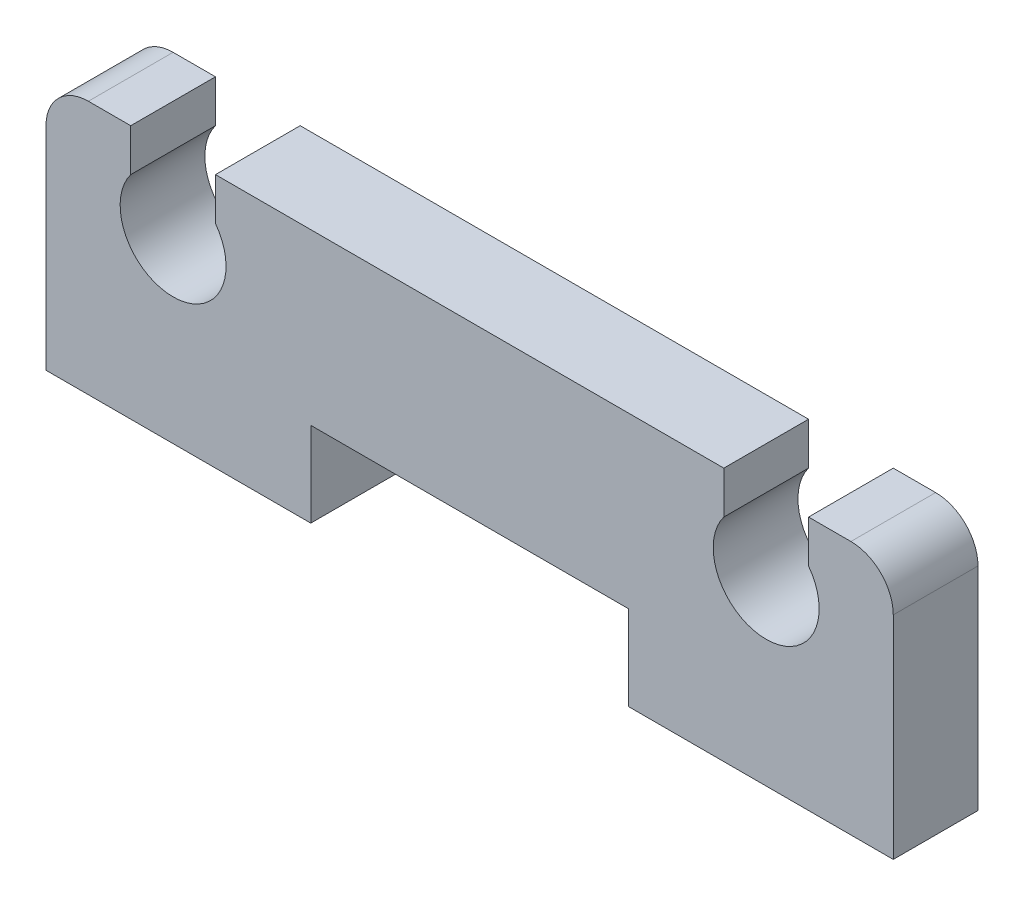
ISO-10303-21;
HEADER;
FILE_DESCRIPTION(('STEP AP214'),'2;1');
FILE_NAME('part.step','',(''),(''),'','','');
FILE_SCHEMA(('AUTOMOTIVE_DESIGN { 1 0 10303 214 1 1 1 1 }'));
ENDSEC;
DATA;
#1=APPLICATION_CONTEXT('core data for automotive mechanical design processes');
#2=APPLICATION_PROTOCOL_DEFINITION('international standard','automotive_design',2000,#1);
#3=PRODUCT_CONTEXT('',#1,'mechanical');
#4=PRODUCT('Part','Part','',(#3));
#5=PRODUCT_RELATED_PRODUCT_CATEGORY('part','',(#4));
#6=PRODUCT_DEFINITION_FORMATION('','',#4);
#7=PRODUCT_DEFINITION_CONTEXT('part definition',#1,'design');
#8=PRODUCT_DEFINITION('design','',#6,#7);
#9=PRODUCT_DEFINITION_SHAPE('','',#8);
#10=(LENGTH_UNIT() NAMED_UNIT(*) SI_UNIT(.MILLI.,.METRE.));
#11=(NAMED_UNIT(*) PLANE_ANGLE_UNIT() SI_UNIT($,.RADIAN.));
#12=(NAMED_UNIT(*) SI_UNIT($,.STERADIAN.) SOLID_ANGLE_UNIT());
#13=UNCERTAINTY_MEASURE_WITH_UNIT(LENGTH_MEASURE(1.E-05),#10,'distance_accuracy_value','');
#14=(GEOMETRIC_REPRESENTATION_CONTEXT(3) GLOBAL_UNCERTAINTY_ASSIGNED_CONTEXT((#13)) GLOBAL_UNIT_ASSIGNED_CONTEXT((#10,
#11,#12)) REPRESENTATION_CONTEXT('',''));
#15=CARTESIAN_POINT('',(0.,0.,0.));
#16=DIRECTION('',(0.,0.,1.));
#17=DIRECTION('',(1.,0.,0.));
#18=AXIS2_PLACEMENT_3D('',#15,#16,#17);
#19=CARTESIAN_POINT('',(1966.10984128656,1293.96021685123,2.));
#20=DIRECTION('',(0.,0.,-1.));
#21=DIRECTION('',(-1.,0.,0.));
#22=AXIS2_PLACEMENT_3D('',#19,#20,#21);
#23=CYLINDRICAL_SURFACE('',#22,1.);
#24=CARTESIAN_POINT('',(1966.10984128656,1293.96021685123,0.));
#25=DIRECTION('',(0.,0.,1.));
#26=DIRECTION('',(1.,0.,0.));
#27=AXIS2_PLACEMENT_3D('',#24,#25,#26);
#28=CIRCLE('',#27,1.);
#29=CARTESIAN_POINT('',(1966.10984128656,1294.96021685123,0.));
#30=VERTEX_POINT('',#29);
#31=CARTESIAN_POINT('',(1965.10984128656,1293.96021685123,0.));
#32=VERTEX_POINT('',#31);
#33=EDGE_CURVE('E190',#30,#32,#28,.T.);
#34=ORIENTED_EDGE('',*,*,#33,.T.);
#35=DIRECTION('',(0.,0.,-1.));
#36=VECTOR('',#35,1.);
#37=CARTESIAN_POINT('',(1965.10984128656,1293.96021685123,2.));
#38=LINE('',#37,#36);
#39=CARTESIAN_POINT('',(1965.10984128656,1293.96021685123,2.));
#40=VERTEX_POINT('',#39);
#41=EDGE_CURVE('E11',#40,#32,#38,.T.);
#42=ORIENTED_EDGE('',*,*,#41,.F.);
#43=CARTESIAN_POINT('',(1966.10984128656,1293.96021685123,2.));
#44=DIRECTION('',(0.,0.,1.));
#45=DIRECTION('',(1.,0.,0.));
#46=AXIS2_PLACEMENT_3D('',#43,#44,#45);
#47=CIRCLE('',#46,1.);
#48=CARTESIAN_POINT('',(1966.10984128656,1294.96021685123,2.));
#49=VERTEX_POINT('',#48);
#50=EDGE_CURVE('E224',#49,#40,#47,.T.);
#51=ORIENTED_EDGE('',*,*,#50,.F.);
#52=DIRECTION('',(0.,0.,-1.));
#53=VECTOR('',#52,1.);
#54=CARTESIAN_POINT('',(1966.10984128656,1294.96021685123,2.));
#55=LINE('',#54,#53);
#56=EDGE_CURVE('E186',#49,#30,#55,.T.);
#57=ORIENTED_EDGE('',*,*,#56,.T.);
#58=EDGE_LOOP('',(#34,#42,#51,#57));
#59=FACE_BOUND('',#58,.T.);
#60=ADVANCED_FACE('F34',(#59),#23,.T.);
#61=CARTESIAN_POINT('',(1965.10984128656,1288.96021685123,2.));
#62=DIRECTION('',(1.,0.,0.));
#63=DIRECTION('',(0.,0.,-1.));
#64=AXIS2_PLACEMENT_3D('',#61,#62,#63);
#65=PLANE('',#64);
#66=DIRECTION('',(0.,-1.,0.));
#67=VECTOR('',#66,1.);
#68=CARTESIAN_POINT('',(1965.10984128656,1288.96021685123,0.));
#69=LINE('',#68,#67);
#70=CARTESIAN_POINT('',(1965.10984128656,1288.96021685123,0.));
#71=VERTEX_POINT('',#70);
#72=EDGE_CURVE('E193',#32,#71,#69,.T.);
#73=ORIENTED_EDGE('',*,*,#72,.T.);
#74=DIRECTION('',(0.,0.,-1.));
#75=VECTOR('',#74,1.);
#76=CARTESIAN_POINT('',(1965.10984128656,1288.96021685123,2.));
#77=LINE('',#76,#75);
#78=CARTESIAN_POINT('',(1965.10984128656,1288.96021685123,2.));
#79=VERTEX_POINT('',#78);
#80=EDGE_CURVE('E42',#79,#71,#77,.T.);
#81=ORIENTED_EDGE('',*,*,#80,.F.);
#82=DIRECTION('',(0.,-1.,0.));
#83=VECTOR('',#82,1.);
#84=CARTESIAN_POINT('',(1965.10984128656,1288.96021685123,2.));
#85=LINE('',#84,#83);
#86=EDGE_CURVE('E123',#40,#79,#85,.T.);
#87=ORIENTED_EDGE('',*,*,#86,.F.);
#88=ORIENTED_EDGE('',*,*,#41,.T.);
#89=EDGE_LOOP('',(#73,#81,#87,#88));
#90=FACE_BOUND('',#89,.T.);
#91=ADVANCED_FACE('F332',(#90),#65,.F.);
#92=CARTESIAN_POINT('',(1965.10984128656,1288.96021685123,2.));
#93=DIRECTION('',(0.,1.,0.));
#94=DIRECTION('',(0.,0.,1.));
#95=AXIS2_PLACEMENT_3D('',#92,#93,#94);
#96=PLANE('',#95);
#97=DIRECTION('',(1.,0.,0.));
#98=VECTOR('',#97,1.);
#99=CARTESIAN_POINT('',(1965.10984128656,1288.96021685123,0.));
#100=LINE('',#99,#98);
#101=CARTESIAN_POINT('',(1971.35984128656,1288.96021685123,0.));
#102=VERTEX_POINT('',#101);
#103=EDGE_CURVE('E195',#71,#102,#100,.T.);
#104=ORIENTED_EDGE('',*,*,#103,.T.);
#105=DIRECTION('',(0.,0.,-1.));
#106=VECTOR('',#105,1.);
#107=CARTESIAN_POINT('',(1971.35984128656,1288.96021685123,2.));
#108=LINE('',#107,#106);
#109=CARTESIAN_POINT('',(1971.35984128656,1288.96021685123,2.));
#110=VERTEX_POINT('',#109);
#111=EDGE_CURVE('E261',#110,#102,#108,.T.);
#112=ORIENTED_EDGE('',*,*,#111,.F.);
#113=DIRECTION('',(1.,0.,0.));
#114=VECTOR('',#113,1.);
#115=CARTESIAN_POINT('',(1965.10984128656,1288.96021685123,2.));
#116=LINE('',#115,#114);
#117=EDGE_CURVE('E269',#79,#110,#116,.T.);
#118=ORIENTED_EDGE('',*,*,#117,.F.);
#119=ORIENTED_EDGE('',*,*,#80,.T.);
#120=EDGE_LOOP('',(#104,#112,#118,#119));
#121=FACE_BOUND('',#120,.T.);
#122=ADVANCED_FACE('F267',(#121),#96,.F.);
#123=CARTESIAN_POINT('',(1971.35984128656,1290.96021685123,2.));
#124=DIRECTION('',(-1.,-1.11022302462503E-13,0.));
#125=DIRECTION('',(1.11022302462503E-13,-1.,0.));
#126=AXIS2_PLACEMENT_3D('',#123,#124,#125);
#127=PLANE('',#126);
#128=DIRECTION('',(-1.11022302462503E-13,1.,0.));
#129=VECTOR('',#128,1.);
#130=CARTESIAN_POINT('',(1971.35984128656,1290.96021685123,0.));
#131=LINE('',#130,#129);
#132=CARTESIAN_POINT('',(1971.35984128656,1290.96021685123,0.));
#133=VERTEX_POINT('',#132);
#134=EDGE_CURVE('E197',#102,#133,#131,.T.);
#135=ORIENTED_EDGE('',*,*,#134,.T.);
#136=DIRECTION('',(0.,0.,-1.));
#137=VECTOR('',#136,1.);
#138=CARTESIAN_POINT('',(1971.35984128656,1290.96021685123,2.));
#139=LINE('',#138,#137);
#140=CARTESIAN_POINT('',(1971.35984128656,1290.96021685123,2.));
#141=VERTEX_POINT('',#140);
#142=EDGE_CURVE('E258',#141,#133,#139,.T.);
#143=ORIENTED_EDGE('',*,*,#142,.F.);
#144=DIRECTION('',(-1.11022302462503E-13,1.,0.));
#145=VECTOR('',#144,1.);
#146=CARTESIAN_POINT('',(1971.35984128656,1290.96021685123,2.));
#147=LINE('',#146,#145);
#148=EDGE_CURVE('E287',#110,#141,#147,.T.);
#149=ORIENTED_EDGE('',*,*,#148,.F.);
#150=ORIENTED_EDGE('',*,*,#111,.T.);
#151=EDGE_LOOP('',(#135,#143,#149,#150));
#152=FACE_BOUND('',#151,.T.);
#153=ADVANCED_FACE('F278',(#152),#127,.F.);
#154=CARTESIAN_POINT('',(1971.35984128656,1290.96021685123,2.));
#155=DIRECTION('',(0.,1.,0.));
#156=DIRECTION('',(0.,0.,1.));
#157=AXIS2_PLACEMENT_3D('',#154,#155,#156);
#158=PLANE('',#157);
#159=DIRECTION('',(1.,0.,0.));
#160=VECTOR('',#159,1.);
#161=CARTESIAN_POINT('',(1971.35984128656,1290.96021685123,0.));
#162=LINE('',#161,#160);
#163=CARTESIAN_POINT('',(1978.85984128656,1290.96021685123,0.));
#164=VERTEX_POINT('',#163);
#165=EDGE_CURVE('E199',#133,#164,#162,.T.);
#166=ORIENTED_EDGE('',*,*,#165,.T.);
#167=DIRECTION('',(0.,0.,-1.));
#168=VECTOR('',#167,1.);
#169=CARTESIAN_POINT('',(1978.85984128656,1290.96021685123,2.));
#170=LINE('',#169,#168);
#171=CARTESIAN_POINT('',(1978.85984128656,1290.96021685123,2.));
#172=VERTEX_POINT('',#171);
#173=EDGE_CURVE('E255',#172,#164,#170,.T.);
#174=ORIENTED_EDGE('',*,*,#173,.F.);
#175=DIRECTION('',(1.,0.,0.));
#176=VECTOR('',#175,1.);
#177=CARTESIAN_POINT('',(1971.35984128656,1290.96021685123,2.));
#178=LINE('',#177,#176);
#179=EDGE_CURVE('E284',#141,#172,#178,.T.);
#180=ORIENTED_EDGE('',*,*,#179,.F.);
#181=ORIENTED_EDGE('',*,*,#142,.T.);
#182=EDGE_LOOP('',(#166,#174,#180,#181));
#183=FACE_BOUND('',#182,.T.);
#184=ADVANCED_FACE('F282',(#183),#158,.F.);
#185=CARTESIAN_POINT('',(1978.85984128656,1290.96021685123,2.));
#186=DIRECTION('',(1.,1.11022302462503E-13,0.));
#187=DIRECTION('',(-1.11022302462503E-13,1.,0.));
#188=AXIS2_PLACEMENT_3D('',#185,#186,#187);
#189=PLANE('',#188);
#190=DIRECTION('',(1.11022302462503E-13,-1.,0.));
#191=VECTOR('',#190,1.);
#192=CARTESIAN_POINT('',(1978.85984128656,1290.96021685123,0.));
#193=LINE('',#192,#191);
#194=CARTESIAN_POINT('',(1978.85984128656,1288.96021685123,0.));
#195=VERTEX_POINT('',#194);
#196=EDGE_CURVE('E201',#164,#195,#193,.T.);
#197=ORIENTED_EDGE('',*,*,#196,.T.);
#198=DIRECTION('',(0.,0.,-1.));
#199=VECTOR('',#198,1.);
#200=CARTESIAN_POINT('',(1978.85984128656,1288.96021685123,2.));
#201=LINE('',#200,#199);
#202=CARTESIAN_POINT('',(1978.85984128656,1288.96021685123,2.));
#203=VERTEX_POINT('',#202);
#204=EDGE_CURVE('E252',#203,#195,#201,.T.);
#205=ORIENTED_EDGE('',*,*,#204,.F.);
#206=DIRECTION('',(1.11022302462503E-13,-1.,0.));
#207=VECTOR('',#206,1.);
#208=CARTESIAN_POINT('',(1978.85984128656,1290.96021685123,2.));
#209=LINE('',#208,#207);
#210=EDGE_CURVE('E286',#172,#203,#209,.T.);
#211=ORIENTED_EDGE('',*,*,#210,.F.);
#212=ORIENTED_EDGE('',*,*,#173,.T.);
#213=EDGE_LOOP('',(#197,#205,#211,#212));
#214=FACE_BOUND('',#213,.T.);
#215=ADVANCED_FACE('F345',(#214),#189,.F.);
#216=CARTESIAN_POINT('',(1978.85984128656,1288.96021685123,2.));
#217=DIRECTION('',(0.,1.,0.));
#218=DIRECTION('',(0.,0.,1.));
#219=AXIS2_PLACEMENT_3D('',#216,#217,#218);
#220=PLANE('',#219);
#221=DIRECTION('',(1.,0.,0.));
#222=VECTOR('',#221,1.);
#223=CARTESIAN_POINT('',(1978.85984128656,1288.96021685123,0.));
#224=LINE('',#223,#222);
#225=CARTESIAN_POINT('',(1985.10984128656,1288.96021685123,0.));
#226=VERTEX_POINT('',#225);
#227=EDGE_CURVE('E203',#195,#226,#224,.T.);
#228=ORIENTED_EDGE('',*,*,#227,.T.);
#229=DIRECTION('',(0.,0.,-1.));
#230=VECTOR('',#229,1.);
#231=CARTESIAN_POINT('',(1985.10984128656,1288.96021685123,2.));
#232=LINE('',#231,#230);
#233=CARTESIAN_POINT('',(1985.10984128656,1288.96021685123,2.));
#234=VERTEX_POINT('',#233);
#235=EDGE_CURVE('E249',#234,#226,#232,.T.);
#236=ORIENTED_EDGE('',*,*,#235,.F.);
#237=DIRECTION('',(1.,0.,0.));
#238=VECTOR('',#237,1.);
#239=CARTESIAN_POINT('',(1978.85984128656,1288.96021685123,2.));
#240=LINE('',#239,#238);
#241=EDGE_CURVE('E289',#203,#234,#240,.T.);
#242=ORIENTED_EDGE('',*,*,#241,.F.);
#243=ORIENTED_EDGE('',*,*,#204,.T.);
#244=EDGE_LOOP('',(#228,#236,#242,#243));
#245=FACE_BOUND('',#244,.T.);
#246=ADVANCED_FACE('F348',(#245),#220,.F.);
#247=CARTESIAN_POINT('',(1985.10984128656,1293.96021685123,2.));
#248=DIRECTION('',(-1.,0.,0.));
#249=DIRECTION('',(0.,0.,1.));
#250=AXIS2_PLACEMENT_3D('',#247,#248,#249);
#251=PLANE('',#250);
#252=DIRECTION('',(0.,1.,0.));
#253=VECTOR('',#252,1.);
#254=CARTESIAN_POINT('',(1985.10984128656,1293.96021685123,0.));
#255=LINE('',#254,#253);
#256=CARTESIAN_POINT('',(1985.10984128656,1293.96021685123,0.));
#257=VERTEX_POINT('',#256);
#258=EDGE_CURVE('E205',#226,#257,#255,.T.);
#259=ORIENTED_EDGE('',*,*,#258,.T.);
#260=DIRECTION('',(0.,0.,-1.));
#261=VECTOR('',#260,1.);
#262=CARTESIAN_POINT('',(1985.10984128656,1293.96021685123,2.));
#263=LINE('',#262,#261);
#264=CARTESIAN_POINT('',(1985.10984128656,1293.96021685123,2.));
#265=VERTEX_POINT('',#264);
#266=EDGE_CURVE('E246',#265,#257,#263,.T.);
#267=ORIENTED_EDGE('',*,*,#266,.F.);
#268=DIRECTION('',(0.,1.,0.));
#269=VECTOR('',#268,1.);
#270=CARTESIAN_POINT('',(1985.10984128656,1293.96021685123,2.));
#271=LINE('',#270,#269);
#272=EDGE_CURVE('E295',#234,#265,#271,.T.);
#273=ORIENTED_EDGE('',*,*,#272,.F.);
#274=ORIENTED_EDGE('',*,*,#235,.T.);
#275=EDGE_LOOP('',(#259,#267,#273,#274));
#276=FACE_BOUND('',#275,.T.);
#277=ADVANCED_FACE('F352',(#276),#251,.F.);
#278=CARTESIAN_POINT('',(1984.10984128656,1293.96021685123,2.));
#279=DIRECTION('',(0.,0.,-1.));
#280=DIRECTION('',(-1.,0.,0.));
#281=AXIS2_PLACEMENT_3D('',#278,#279,#280);
#282=CYLINDRICAL_SURFACE('',#281,1.00000000000011);
#283=CARTESIAN_POINT('',(1984.10984128656,1293.96021685123,0.));
#284=DIRECTION('',(0.,0.,1.));
#285=DIRECTION('',(1.,0.,0.));
#286=AXIS2_PLACEMENT_3D('',#283,#284,#285);
#287=CIRCLE('',#286,1.00000000000011);
#288=CARTESIAN_POINT('',(1984.10984128656,1294.96021685123,0.));
#289=VERTEX_POINT('',#288);
#290=EDGE_CURVE('E207',#257,#289,#287,.T.);
#291=ORIENTED_EDGE('',*,*,#290,.T.);
#292=DIRECTION('',(0.,0.,-1.));
#293=VECTOR('',#292,1.);
#294=CARTESIAN_POINT('',(1984.10984128656,1294.96021685123,2.));
#295=LINE('',#294,#293);
#296=CARTESIAN_POINT('',(1984.10984128656,1294.96021685123,2.));
#297=VERTEX_POINT('',#296);
#298=EDGE_CURVE('E243',#297,#289,#295,.T.);
#299=ORIENTED_EDGE('',*,*,#298,.F.);
#300=CARTESIAN_POINT('',(1984.10984128656,1293.96021685123,2.));
#301=DIRECTION('',(0.,0.,1.));
#302=DIRECTION('',(1.,0.,0.));
#303=AXIS2_PLACEMENT_3D('',#300,#301,#302);
#304=CIRCLE('',#303,1.00000000000011);
#305=EDGE_CURVE('E297',#265,#297,#304,.T.);
#306=ORIENTED_EDGE('',*,*,#305,.F.);
#307=ORIENTED_EDGE('',*,*,#266,.T.);
#308=EDGE_LOOP('',(#291,#299,#306,#307));
#309=FACE_BOUND('',#308,.T.);
#310=ADVANCED_FACE('F356',(#309),#282,.T.);
#311=CARTESIAN_POINT('',(1983.10984128656,1294.96021685123,2.));
#312=DIRECTION('',(-2.22044604925006E-13,-1.,0.));
#313=DIRECTION('',(1.,-2.22044604925006E-13,0.));
#314=AXIS2_PLACEMENT_3D('',#311,#312,#313);
#315=PLANE('',#314);
#316=DIRECTION('',(-1.,2.22044604925006E-13,0.));
#317=VECTOR('',#316,1.);
#318=CARTESIAN_POINT('',(1983.10984128656,1294.96021685123,0.));
#319=LINE('',#318,#317);
#320=CARTESIAN_POINT('',(1983.10984128656,1294.96021685123,0.));
#321=VERTEX_POINT('',#320);
#322=EDGE_CURVE('E209',#289,#321,#319,.T.);
#323=ORIENTED_EDGE('',*,*,#322,.T.);
#324=DIRECTION('',(0.,0.,-1.));
#325=VECTOR('',#324,1.);
#326=CARTESIAN_POINT('',(1983.10984128656,1294.96021685123,2.));
#327=LINE('',#326,#325);
#328=CARTESIAN_POINT('',(1983.10984128656,1294.96021685123,2.));
#329=VERTEX_POINT('',#328);
#330=EDGE_CURVE('E240',#329,#321,#327,.T.);
#331=ORIENTED_EDGE('',*,*,#330,.F.);
#332=DIRECTION('',(-1.,2.22044604925006E-13,0.));
#333=VECTOR('',#332,1.);
#334=CARTESIAN_POINT('',(1983.10984128656,1294.96021685123,2.));
#335=LINE('',#334,#333);
#336=EDGE_CURVE('E299',#297,#329,#335,.T.);
#337=ORIENTED_EDGE('',*,*,#336,.F.);
#338=ORIENTED_EDGE('',*,*,#298,.T.);
#339=EDGE_LOOP('',(#323,#331,#337,#338));
#340=FACE_BOUND('',#339,.T.);
#341=ADVANCED_FACE('F360',(#340),#315,.F.);
#342=CARTESIAN_POINT('',(1983.10984128656,1294.96021685123,2.));
#343=DIRECTION('',(1.,-2.22044604924908E-13,0.));
#344=DIRECTION('',(2.22044604924908E-13,1.,0.));
#345=AXIS2_PLACEMENT_3D('',#342,#343,#344);
#346=PLANE('',#345);
#347=DIRECTION('',(-2.22044604924908E-13,-1.,0.));
#348=VECTOR('',#347,1.);
#349=CARTESIAN_POINT('',(1983.10984128656,1294.96021685123,0.));
#350=LINE('',#349,#348);
#351=CARTESIAN_POINT('',(1983.10984128656,1293.96021685123,0.));
#352=VERTEX_POINT('',#351);
#353=EDGE_CURVE('E211',#321,#352,#350,.T.);
#354=ORIENTED_EDGE('',*,*,#353,.T.);
#355=DIRECTION('',(0.,0.,-1.));
#356=VECTOR('',#355,1.);
#357=CARTESIAN_POINT('',(1983.10984128656,1293.96021685123,2.));
#358=LINE('',#357,#356);
#359=CARTESIAN_POINT('',(1983.10984128656,1293.96021685123,2.));
#360=VERTEX_POINT('',#359);
#361=EDGE_CURVE('E237',#360,#352,#358,.T.);
#362=ORIENTED_EDGE('',*,*,#361,.F.);
#363=DIRECTION('',(-2.22044604924908E-13,-1.,0.));
#364=VECTOR('',#363,1.);
#365=CARTESIAN_POINT('',(1983.10984128656,1294.96021685123,2.));
#366=LINE('',#365,#364);
#367=EDGE_CURVE('E301',#329,#360,#366,.T.);
#368=ORIENTED_EDGE('',*,*,#367,.F.);
#369=ORIENTED_EDGE('',*,*,#330,.T.);
#370=EDGE_LOOP('',(#354,#362,#368,#369));
#371=FACE_BOUND('',#370,.T.);
#372=ADVANCED_FACE('F364',(#371),#346,.F.);
#373=CARTESIAN_POINT('',(1982.10984128656,1293.21021685123,2.));
#374=DIRECTION('',(0.,0.,-1.));
#375=DIRECTION('',(-1.,0.,0.));
#376=AXIS2_PLACEMENT_3D('',#373,#374,#375);
#377=CYLINDRICAL_SURFACE('',#376,1.24999999999988);
#378=CARTESIAN_POINT('',(1982.10984128656,1293.21021685123,0.));
#379=DIRECTION('',(0.,0.,-1.));
#380=DIRECTION('',(1.,0.,0.));
#381=AXIS2_PLACEMENT_3D('',#378,#379,#380);
#382=CIRCLE('',#381,1.24999999999988);
#383=CARTESIAN_POINT('',(1981.10984128656,1293.96021685123,0.));
#384=VERTEX_POINT('',#383);
#385=EDGE_CURVE('E213',#352,#384,#382,.T.);
#386=ORIENTED_EDGE('',*,*,#385,.T.);
#387=DIRECTION('',(0.,0.,-1.));
#388=VECTOR('',#387,1.);
#389=CARTESIAN_POINT('',(1981.10984128656,1293.96021685123,2.));
#390=LINE('',#389,#388);
#391=CARTESIAN_POINT('',(1981.10984128656,1293.96021685123,2.));
#392=VERTEX_POINT('',#391);
#393=EDGE_CURVE('E234',#392,#384,#390,.T.);
#394=ORIENTED_EDGE('',*,*,#393,.F.);
#395=CARTESIAN_POINT('',(1982.10984128656,1293.21021685123,2.));
#396=DIRECTION('',(0.,0.,-1.));
#397=DIRECTION('',(1.,0.,0.));
#398=AXIS2_PLACEMENT_3D('',#395,#396,#397);
#399=CIRCLE('',#398,1.24999999999988);
#400=EDGE_CURVE('E303',#360,#392,#399,.T.);
#401=ORIENTED_EDGE('',*,*,#400,.F.);
#402=ORIENTED_EDGE('',*,*,#361,.T.);
#403=EDGE_LOOP('',(#386,#394,#401,#402));
#404=FACE_BOUND('',#403,.T.);
#405=ADVANCED_FACE('F368',(#404),#377,.F.);
#406=CARTESIAN_POINT('',(1981.10984128656,1294.96021685123,2.));
#407=DIRECTION('',(-1.,2.220446049255E-13,0.));
#408=DIRECTION('',(-2.220446049255E-13,-1.,0.));
#409=AXIS2_PLACEMENT_3D('',#406,#407,#408);
#410=PLANE('',#409);
#411=DIRECTION('',(2.220446049255E-13,1.,0.));
#412=VECTOR('',#411,1.);
#413=CARTESIAN_POINT('',(1981.10984128656,1294.96021685123,0.));
#414=LINE('',#413,#412);
#415=CARTESIAN_POINT('',(1981.10984128656,1294.96021685123,0.));
#416=VERTEX_POINT('',#415);
#417=EDGE_CURVE('E215',#384,#416,#414,.T.);
#418=ORIENTED_EDGE('',*,*,#417,.T.);
#419=DIRECTION('',(0.,0.,-1.));
#420=VECTOR('',#419,1.);
#421=CARTESIAN_POINT('',(1981.10984128656,1294.96021685123,2.));
#422=LINE('',#421,#420);
#423=CARTESIAN_POINT('',(1981.10984128656,1294.96021685123,2.));
#424=VERTEX_POINT('',#423);
#425=EDGE_CURVE('E231',#424,#416,#422,.T.);
#426=ORIENTED_EDGE('',*,*,#425,.F.);
#427=DIRECTION('',(2.220446049255E-13,1.,0.));
#428=VECTOR('',#427,1.);
#429=CARTESIAN_POINT('',(1981.10984128656,1294.96021685123,2.));
#430=LINE('',#429,#428);
#431=EDGE_CURVE('E305',#392,#424,#430,.T.);
#432=ORIENTED_EDGE('',*,*,#431,.F.);
#433=ORIENTED_EDGE('',*,*,#393,.T.);
#434=EDGE_LOOP('',(#418,#426,#432,#433));
#435=FACE_BOUND('',#434,.T.);
#436=ADVANCED_FACE('F372',(#435),#410,.F.);
#437=CARTESIAN_POINT('',(1969.10984128656,1294.96021685123,2.));
#438=DIRECTION('',(-2.22044604925015E-13,-1.,0.));
#439=DIRECTION('',(1.,-2.22044604925015E-13,0.));
#440=AXIS2_PLACEMENT_3D('',#437,#438,#439);
#441=PLANE('',#440);
#442=DIRECTION('',(-1.,2.22044604925015E-13,0.));
#443=VECTOR('',#442,1.);
#444=CARTESIAN_POINT('',(1969.10984128656,1294.96021685123,0.));
#445=LINE('',#444,#443);
#446=CARTESIAN_POINT('',(1969.10984128656,1294.96021685123,0.));
#447=VERTEX_POINT('',#446);
#448=EDGE_CURVE('E217',#416,#447,#445,.T.);
#449=ORIENTED_EDGE('',*,*,#448,.T.);
#450=DIRECTION('',(0.,0.,-1.));
#451=VECTOR('',#450,1.);
#452=CARTESIAN_POINT('',(1969.10984128656,1294.96021685123,2.));
#453=LINE('',#452,#451);
#454=CARTESIAN_POINT('',(1969.10984128656,1294.96021685123,2.));
#455=VERTEX_POINT('',#454);
#456=EDGE_CURVE('E228',#455,#447,#453,.T.);
#457=ORIENTED_EDGE('',*,*,#456,.F.);
#458=DIRECTION('',(-1.,2.22044604925015E-13,0.));
#459=VECTOR('',#458,1.);
#460=CARTESIAN_POINT('',(1969.10984128656,1294.96021685123,2.));
#461=LINE('',#460,#459);
#462=EDGE_CURVE('E307',#424,#455,#461,.T.);
#463=ORIENTED_EDGE('',*,*,#462,.F.);
#464=ORIENTED_EDGE('',*,*,#425,.T.);
#465=EDGE_LOOP('',(#449,#457,#463,#464));
#466=FACE_BOUND('',#465,.T.);
#467=ADVANCED_FACE('F313',(#466),#441,.F.);
#468=CARTESIAN_POINT('',(1969.10984128656,1294.96021685123,2.));
#469=DIRECTION('',(1.,-2.22044604925006E-13,0.));
#470=DIRECTION('',(2.22044604925006E-13,1.,0.));
#471=AXIS2_PLACEMENT_3D('',#468,#469,#470);
#472=PLANE('',#471);
#473=DIRECTION('',(-2.22044604925006E-13,-1.,0.));
#474=VECTOR('',#473,1.);
#475=CARTESIAN_POINT('',(1969.10984128656,1294.96021685123,0.));
#476=LINE('',#475,#474);
#477=CARTESIAN_POINT('',(1969.10984128656,1293.96021685123,0.));
#478=VERTEX_POINT('',#477);
#479=EDGE_CURVE('E219',#447,#478,#476,.T.);
#480=ORIENTED_EDGE('',*,*,#479,.T.);
#481=DIRECTION('',(0.,0.,-1.));
#482=VECTOR('',#481,1.);
#483=CARTESIAN_POINT('',(1969.10984128656,1293.96021685123,2.));
#484=LINE('',#483,#482);
#485=CARTESIAN_POINT('',(1969.10984128656,1293.96021685123,2.));
#486=VERTEX_POINT('',#485);
#487=EDGE_CURVE('E181',#486,#478,#484,.T.);
#488=ORIENTED_EDGE('',*,*,#487,.F.);
#489=DIRECTION('',(-2.22044604925006E-13,-1.,0.));
#490=VECTOR('',#489,1.);
#491=CARTESIAN_POINT('',(1969.10984128656,1294.96021685123,2.));
#492=LINE('',#491,#490);
#493=EDGE_CURVE('E172',#455,#486,#492,.T.);
#494=ORIENTED_EDGE('',*,*,#493,.F.);
#495=ORIENTED_EDGE('',*,*,#456,.T.);
#496=EDGE_LOOP('',(#480,#488,#494,#495));
#497=FACE_BOUND('',#496,.T.);
#498=ADVANCED_FACE('F317',(#497),#472,.F.);
#499=CARTESIAN_POINT('',(1968.10984128656,1293.21021685123,2.));
#500=DIRECTION('',(0.,0.,-1.));
#501=DIRECTION('',(-1.,0.,0.));
#502=AXIS2_PLACEMENT_3D('',#499,#500,#501);
#503=CYLINDRICAL_SURFACE('',#502,1.24999999999975);
#504=CARTESIAN_POINT('',(1968.10984128656,1293.21021685123,0.));
#505=DIRECTION('',(0.,0.,-1.));
#506=DIRECTION('',(1.,0.,0.));
#507=AXIS2_PLACEMENT_3D('',#504,#505,#506);
#508=CIRCLE('',#507,1.24999999999975);
#509=CARTESIAN_POINT('',(1967.10984128656,1293.96021685123,0.));
#510=VERTEX_POINT('',#509);
#511=EDGE_CURVE('E180',#478,#510,#508,.T.);
#512=ORIENTED_EDGE('',*,*,#511,.T.);
#513=DIRECTION('',(0.,0.,-1.));
#514=VECTOR('',#513,1.);
#515=CARTESIAN_POINT('',(1967.10984128656,1293.96021685123,2.));
#516=LINE('',#515,#514);
#517=CARTESIAN_POINT('',(1967.10984128656,1293.96021685123,2.));
#518=VERTEX_POINT('',#517);
#519=EDGE_CURVE('E177',#518,#510,#516,.T.);
#520=ORIENTED_EDGE('',*,*,#519,.F.);
#521=CARTESIAN_POINT('',(1968.10984128656,1293.21021685123,2.));
#522=DIRECTION('',(0.,0.,-1.));
#523=DIRECTION('',(1.,0.,0.));
#524=AXIS2_PLACEMENT_3D('',#521,#522,#523);
#525=CIRCLE('',#524,1.24999999999975);
#526=EDGE_CURVE('E166',#486,#518,#525,.T.);
#527=ORIENTED_EDGE('',*,*,#526,.F.);
#528=ORIENTED_EDGE('',*,*,#487,.T.);
#529=EDGE_LOOP('',(#512,#520,#527,#528));
#530=FACE_BOUND('',#529,.T.);
#531=ADVANCED_FACE('F178',(#530),#503,.F.);
#532=CARTESIAN_POINT('',(1967.10984128656,1294.96021685123,2.));
#533=DIRECTION('',(-1.,2.22044604924809E-13,0.));
#534=DIRECTION('',(-2.22044604924809E-13,-1.,0.));
#535=AXIS2_PLACEMENT_3D('',#532,#533,#534);
#536=PLANE('',#535);
#537=DIRECTION('',(2.22044604924809E-13,1.,0.));
#538=VECTOR('',#537,1.);
#539=CARTESIAN_POINT('',(1967.10984128656,1294.96021685123,0.));
#540=LINE('',#539,#538);
#541=CARTESIAN_POINT('',(1967.10984128656,1294.96021685123,0.));
#542=VERTEX_POINT('',#541);
#543=EDGE_CURVE('E109',#510,#542,#540,.T.);
#544=ORIENTED_EDGE('',*,*,#543,.T.);
#545=DIRECTION('',(0.,0.,-1.));
#546=VECTOR('',#545,1.);
#547=CARTESIAN_POINT('',(1967.10984128656,1294.96021685123,2.));
#548=LINE('',#547,#546);
#549=CARTESIAN_POINT('',(1967.10984128656,1294.96021685123,2.));
#550=VERTEX_POINT('',#549);
#551=EDGE_CURVE('E182',#550,#542,#548,.T.);
#552=ORIENTED_EDGE('',*,*,#551,.F.);
#553=DIRECTION('',(2.22044604924809E-13,1.,0.));
#554=VECTOR('',#553,1.);
#555=CARTESIAN_POINT('',(1967.10984128656,1294.96021685123,2.));
#556=LINE('',#555,#554);
#557=EDGE_CURVE('E170',#518,#550,#556,.T.);
#558=ORIENTED_EDGE('',*,*,#557,.F.);
#559=ORIENTED_EDGE('',*,*,#519,.T.);
#560=EDGE_LOOP('',(#544,#552,#558,#559));
#561=FACE_BOUND('',#560,.T.);
#562=ADVANCED_FACE('F184',(#561),#536,.F.);
#563=CARTESIAN_POINT('',(1967.10984128656,1294.96021685123,2.));
#564=DIRECTION('',(2.22044604925006E-13,-1.,0.));
#565=DIRECTION('',(1.,2.22044604925006E-13,0.));
#566=AXIS2_PLACEMENT_3D('',#563,#564,#565);
#567=PLANE('',#566);
#568=DIRECTION('',(-1.,-2.22044604925006E-13,0.));
#569=VECTOR('',#568,1.);
#570=CARTESIAN_POINT('',(1967.10984128656,1294.96021685123,0.));
#571=LINE('',#570,#569);
#572=EDGE_CURVE('E115',#542,#30,#571,.T.);
#573=ORIENTED_EDGE('',*,*,#572,.T.);
#574=ORIENTED_EDGE('',*,*,#56,.F.);
#575=DIRECTION('',(-1.,-2.22044604925006E-13,0.));
#576=VECTOR('',#575,1.);
#577=CARTESIAN_POINT('',(1967.10984128656,1294.96021685123,2.));
#578=LINE('',#577,#576);
#579=EDGE_CURVE('E50',#550,#49,#578,.T.);
#580=ORIENTED_EDGE('',*,*,#579,.F.);
#581=ORIENTED_EDGE('',*,*,#551,.T.);
#582=EDGE_LOOP('',(#573,#574,#580,#581));
#583=FACE_BOUND('',#582,.T.);
#584=ADVANCED_FACE('F321',(#583),#567,.F.);
#585=CARTESIAN_POINT('',(1966.10984128656,1293.96021685123,2.));
#586=DIRECTION('',(0.,0.,1.));
#587=DIRECTION('',(1.,0.,0.));
#588=AXIS2_PLACEMENT_3D('',#585,#586,#587);
#589=PLANE('',#588);
#590=ORIENTED_EDGE('',*,*,#50,.T.);
#591=ORIENTED_EDGE('',*,*,#86,.T.);
#592=ORIENTED_EDGE('',*,*,#117,.T.);
#593=ORIENTED_EDGE('',*,*,#148,.T.);
#594=ORIENTED_EDGE('',*,*,#179,.T.);
#595=ORIENTED_EDGE('',*,*,#210,.T.);
#596=ORIENTED_EDGE('',*,*,#241,.T.);
#597=ORIENTED_EDGE('',*,*,#272,.T.);
#598=ORIENTED_EDGE('',*,*,#305,.T.);
#599=ORIENTED_EDGE('',*,*,#336,.T.);
#600=ORIENTED_EDGE('',*,*,#367,.T.);
#601=ORIENTED_EDGE('',*,*,#400,.T.);
#602=ORIENTED_EDGE('',*,*,#431,.T.);
#603=ORIENTED_EDGE('',*,*,#462,.T.);
#604=ORIENTED_EDGE('',*,*,#493,.T.);
#605=ORIENTED_EDGE('',*,*,#526,.T.);
#606=ORIENTED_EDGE('',*,*,#557,.T.);
#607=ORIENTED_EDGE('',*,*,#579,.T.);
#608=EDGE_LOOP('',(#590,#591,#592,#593,#594,#595,#596,#597,#598,#599,#600,#601,#602,#603,#604,
#605,#606,#607));
#609=FACE_BOUND('',#608,.T.);
#610=ADVANCED_FACE('F168',(#609),#589,.T.);
#611=CARTESIAN_POINT('',(1966.10984128656,1293.96021685123,0.));
#612=DIRECTION('',(0.,0.,1.));
#613=DIRECTION('',(1.,0.,0.));
#614=AXIS2_PLACEMENT_3D('',#611,#612,#613);
#615=PLANE('',#614);
#616=ORIENTED_EDGE('',*,*,#33,.F.);
#617=ORIENTED_EDGE('',*,*,#572,.F.);
#618=ORIENTED_EDGE('',*,*,#543,.F.);
#619=ORIENTED_EDGE('',*,*,#511,.F.);
#620=ORIENTED_EDGE('',*,*,#479,.F.);
#621=ORIENTED_EDGE('',*,*,#448,.F.);
#622=ORIENTED_EDGE('',*,*,#417,.F.);
#623=ORIENTED_EDGE('',*,*,#385,.F.);
#624=ORIENTED_EDGE('',*,*,#353,.F.);
#625=ORIENTED_EDGE('',*,*,#322,.F.);
#626=ORIENTED_EDGE('',*,*,#290,.F.);
#627=ORIENTED_EDGE('',*,*,#258,.F.);
#628=ORIENTED_EDGE('',*,*,#227,.F.);
#629=ORIENTED_EDGE('',*,*,#196,.F.);
#630=ORIENTED_EDGE('',*,*,#165,.F.);
#631=ORIENTED_EDGE('',*,*,#134,.F.);
#632=ORIENTED_EDGE('',*,*,#103,.F.);
#633=ORIENTED_EDGE('',*,*,#72,.F.);
#634=EDGE_LOOP('',(#616,#617,#618,#619,#620,#621,#622,#623,#624,#625,#626,#627,#628,#629,#630,
#631,#632,#633));
#635=FACE_BOUND('',#634,.T.);
#636=ADVANCED_FACE('F273',(#635),#615,.F.);
#637=CLOSED_SHELL('',(#60,#91,#122,#153,#184,#215,#246,#277,#310,#341,#372,#405,#436,#467,#498,
#531,#562,#584,#610,#636));
#638=MANIFOLD_SOLID_BREP('B2',#637);
#639=ADVANCED_BREP_SHAPE_REPRESENTATION('',(#18,#638),#14);
#640=SHAPE_DEFINITION_REPRESENTATION(#9,#639);
ENDSEC;
END-ISO-10303-21;
